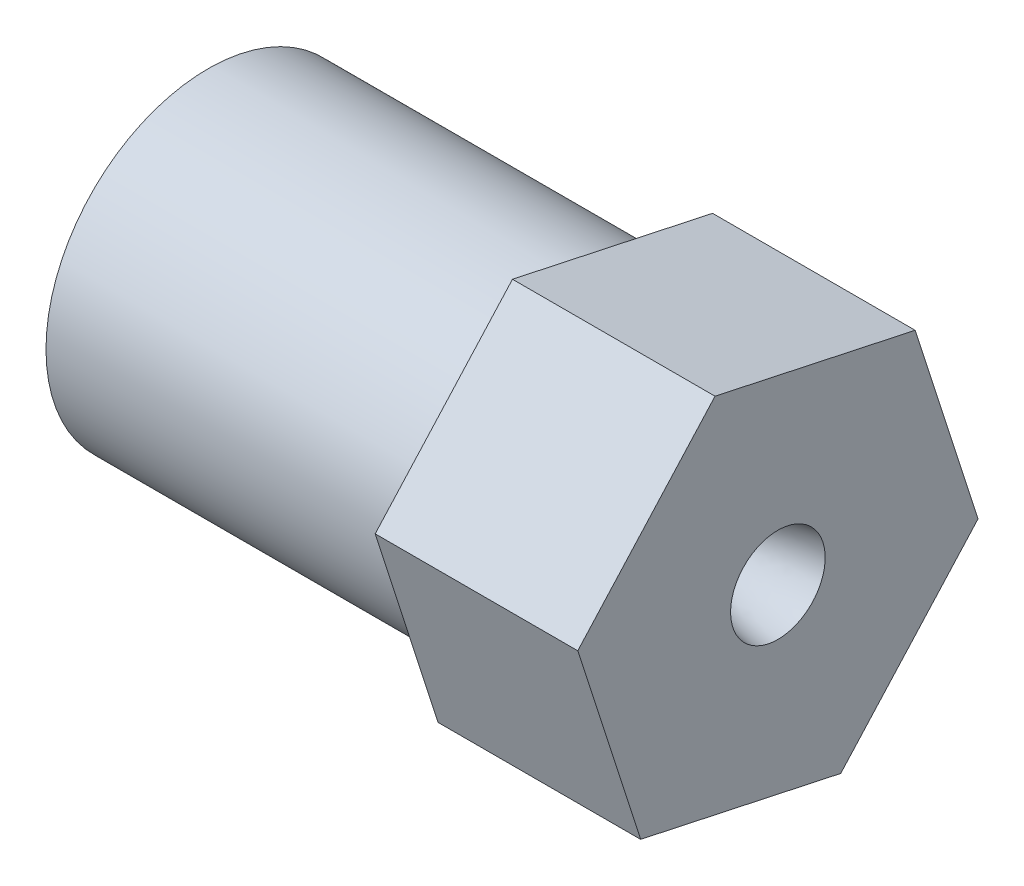
ISO-10303-21;
HEADER;
FILE_DESCRIPTION(('STEP AP214'),'2;1');
FILE_NAME('part.step','',(''),(''),'','','');
FILE_SCHEMA(('AUTOMOTIVE_DESIGN { 1 0 10303 214 1 1 1 1 }'));
ENDSEC;
DATA;
#1=APPLICATION_CONTEXT('core data for automotive mechanical design processes');
#2=APPLICATION_PROTOCOL_DEFINITION('international standard','automotive_design',2000,#1);
#3=PRODUCT_CONTEXT('',#1,'mechanical');
#4=PRODUCT('Part','Part','',(#3));
#5=PRODUCT_RELATED_PRODUCT_CATEGORY('part','',(#4));
#6=PRODUCT_DEFINITION_FORMATION('','',#4);
#7=PRODUCT_DEFINITION_CONTEXT('part definition',#1,'design');
#8=PRODUCT_DEFINITION('design','',#6,#7);
#9=PRODUCT_DEFINITION_SHAPE('','',#8);
#10=(LENGTH_UNIT() NAMED_UNIT(*) SI_UNIT(.MILLI.,.METRE.));
#11=(NAMED_UNIT(*) PLANE_ANGLE_UNIT() SI_UNIT($,.RADIAN.));
#12=(NAMED_UNIT(*) SI_UNIT($,.STERADIAN.) SOLID_ANGLE_UNIT());
#13=UNCERTAINTY_MEASURE_WITH_UNIT(LENGTH_MEASURE(1.E-05),#10,'distance_accuracy_value','');
#14=(GEOMETRIC_REPRESENTATION_CONTEXT(3) GLOBAL_UNCERTAINTY_ASSIGNED_CONTEXT((#13)) GLOBAL_UNIT_ASSIGNED_CONTEXT((#10,
#11,#12)) REPRESENTATION_CONTEXT('',''));
#15=CARTESIAN_POINT('',(0.,0.,0.));
#16=DIRECTION('',(0.,0.,1.));
#17=DIRECTION('',(1.,0.,0.));
#18=AXIS2_PLACEMENT_3D('',#15,#16,#17);
#19=CARTESIAN_POINT('',(0.,0.,0.));
#20=DIRECTION('',(-1.,0.,0.));
#21=DIRECTION('',(0.,0.,1.));
#22=AXIS2_PLACEMENT_3D('',#19,#20,#21);
#23=CYLINDRICAL_SURFACE('',#22,10.16);
#24=CARTESIAN_POINT('',(-9.36024884105208,0.,0.));
#25=DIRECTION('',(1.,0.,0.));
#26=DIRECTION('',(0.,0.,-1.));
#27=AXIS2_PLACEMENT_3D('',#24,#25,#26);
#28=CIRCLE('',#27,10.16);
#29=CARTESIAN_POINT('',(-9.36024884105208,0.,-10.16));
#30=VERTEX_POINT('',#29);
#31=EDGE_CURVE('E11',#30,#30,#28,.F.);
#32=ORIENTED_EDGE('',*,*,#31,.T.);
#33=EDGE_LOOP('',(#32));
#34=FACE_BOUND('',#33,.T.);
#35=CARTESIAN_POINT('',(-31.75,0.,0.));
#36=DIRECTION('',(-1.,0.,0.));
#37=DIRECTION('',(0.,0.,1.));
#38=AXIS2_PLACEMENT_3D('',#35,#36,#37);
#39=CIRCLE('',#38,10.16);
#40=CARTESIAN_POINT('',(-31.75,0.,10.16));
#41=VERTEX_POINT('',#40);
#42=EDGE_CURVE('E225',#41,#41,#39,.T.);
#43=ORIENTED_EDGE('',*,*,#42,.F.);
#44=EDGE_LOOP('',(#43));
#45=FACE_BOUND('',#44,.T.);
#46=ADVANCED_FACE('F37',(#34,#45),#23,.T.);
#47=CARTESIAN_POINT('',(0.,0.,0.));
#48=DIRECTION('',(-1.,0.,0.));
#49=DIRECTION('',(0.,0.,1.));
#50=AXIS2_PLACEMENT_3D('',#47,#48,#49);
#51=TOROIDAL_SURFACE('',#50,5.,3.);
#52=CARTESIAN_POINT('',(0.,0.,0.));
#53=DIRECTION('',(-1.,0.,0.));
#54=DIRECTION('',(0.,0.,1.));
#55=AXIS2_PLACEMENT_3D('',#52,#53,#54);
#56=CIRCLE('',#55,2.00000000003503);
#57=CARTESIAN_POINT('',(0.,0.,2.00000000003503));
#58=VERTEX_POINT('',#57);
#59=EDGE_CURVE('E177',#58,#58,#56,.T.);
#60=ORIENTED_EDGE('',*,*,#59,.F.);
#61=EDGE_LOOP('',(#60));
#62=FACE_BOUND('',#61,.T.);
#63=CARTESIAN_POINT('',(-2.12132034355962,0.,0.));
#64=DIRECTION('',(-1.,0.,0.));
#65=DIRECTION('',(0.,0.,1.));
#66=AXIS2_PLACEMENT_3D('',#63,#64,#65);
#67=CIRCLE('',#66,2.87867965644033);
#68=CARTESIAN_POINT('',(-2.12132034355962,0.,2.87867965644033));
#69=VERTEX_POINT('',#68);
#70=EDGE_CURVE('E142',#69,#69,#67,.T.);
#71=ORIENTED_EDGE('',*,*,#70,.T.);
#72=EDGE_LOOP('',(#71));
#73=FACE_BOUND('',#72,.T.);
#74=ADVANCED_FACE('F166',(#62,#73),#51,.T.);
#75=CARTESIAN_POINT('',(0.,0.,0.));
#76=DIRECTION('',(-1.,0.,0.));
#77=DIRECTION('',(0.,0.,1.));
#78=AXIS2_PLACEMENT_3D('',#75,#76,#77);
#79=TOROIDAL_SURFACE('',#78,2.8,0.799999999964973);
#80=CARTESIAN_POINT('',(0.27361611494392,0.,0.));
#81=DIRECTION('',(-1.,0.,0.));
#82=DIRECTION('',(0.,0.,1.));
#83=AXIS2_PLACEMENT_3D('',#80,#81,#82);
#84=CIRCLE('',#83,2.04824590372976);
#85=CARTESIAN_POINT('',(0.27361611494392,0.,2.04824590372976));
#86=VERTEX_POINT('',#85);
#87=EDGE_CURVE('E231',#86,#86,#84,.T.);
#88=ORIENTED_EDGE('',*,*,#87,.F.);
#89=EDGE_LOOP('',(#88));
#90=FACE_BOUND('',#89,.T.);
#91=ORIENTED_EDGE('',*,*,#59,.T.);
#92=EDGE_LOOP('',(#91));
#93=FACE_BOUND('',#92,.T.);
#94=ADVANCED_FACE('F162',(#90,#93),#79,.T.);
#95=CARTESIAN_POINT('',(336407.394437412,-941733.545655878,0.));
#96=CARTESIAN_POINT('',(-342019.869711802,939694.669030994,0.));
#97=CARTESIAN_POINT('',(347633.439450651,-937647.599422496,0.));
#98=B_SPLINE_CURVE_WITH_KNOTS('',2,(#95,#96,#97),.UNSPECIFIED.,.F.,.F.,(3,3),(0.,1.),.UNSPECIFIED.);
#99=CARTESIAN_POINT('',(0.,0.,0.));
#100=DIRECTION('',(-1.,0.,0.));
#101=AXIS1_PLACEMENT('',#99,#100);
#102=SURFACE_OF_REVOLUTION('',#98,#101);
#103=CARTESIAN_POINT('',(3.97475115894792,0.,0.));
#104=DIRECTION('',(-1.,0.,0.));
#105=DIRECTION('',(0.,0.,1.));
#106=AXIS2_PLACEMENT_3D('',#103,#104,#105);
#107=CIRCLE('',#106,2.96647939483827);
#108=CARTESIAN_POINT('',(3.97475115894792,0.,2.96647939483827));
#109=VERTEX_POINT('',#108);
#110=EDGE_CURVE('E228',#109,#109,#107,.T.);
#111=ORIENTED_EDGE('',*,*,#110,.F.);
#112=EDGE_LOOP('',(#111));
#113=FACE_BOUND('',#112,.T.);
#114=ORIENTED_EDGE('',*,*,#87,.T.);
#115=EDGE_LOOP('',(#114));
#116=FACE_BOUND('',#115,.T.);
#117=ADVANCED_FACE('F157',(#113,#116),#102,.T.);
#118=CARTESIAN_POINT('',(3.97475115894792,10.16,0.));
#119=DIRECTION('',(-1.,0.,0.));
#120=DIRECTION('',(0.,0.,1.));
#121=AXIS2_PLACEMENT_3D('',#118,#119,#120);
#122=PLANE('',#121);
#123=ORIENTED_EDGE('',*,*,#110,.T.);
#124=EDGE_LOOP('',(#123));
#125=FACE_BOUND('',#124,.T.);
#126=DIRECTION('',(0.,-0.951681663898051,-0.307086324345838));
#127=VECTOR('',#126,1.);
#128=CARTESIAN_POINT('',(3.97475115894792,-3.41249677929312,10.5755624900671));
#129=LINE('',#128,#127);
#130=CARTESIAN_POINT('',(3.97475115894792,2.69330707117882,12.5457684242007));
#131=VERTEX_POINT('',#130);
#132=CARTESIAN_POINT('',(3.97475115894792,-9.51830062976507,8.60535655593348));
#133=VERTEX_POINT('',#132);
#134=EDGE_CURVE('E125',#131,#133,#129,.T.);
#135=ORIENTED_EDGE('',*,*,#134,.T.);
#136=DIRECTION('',(0.,-0.209896273910742,-0.977723659424475));
#137=VECTOR('',#136,1.);
#138=CARTESIAN_POINT('',(3.97475115894792,-10.8649541653545,2.33247234383312));
#139=LINE('',#138,#137);
#140=CARTESIAN_POINT('',(3.97475115894792,-12.2116077009439,-3.94041186826723));
#141=VERTEX_POINT('',#140);
#142=EDGE_CURVE('E128',#133,#141,#139,.T.);
#143=ORIENTED_EDGE('',*,*,#142,.T.);
#144=DIRECTION('',(0.,0.741785389987309,-0.670637335078637));
#145=VECTOR('',#144,1.);
#146=CARTESIAN_POINT('',(3.97475115894792,-7.45245738606136,-8.24309014623397));
#147=LINE('',#146,#145);
#148=CARTESIAN_POINT('',(3.97475115894792,-2.69330707117882,-12.5457684242007));
#149=VERTEX_POINT('',#148);
#150=EDGE_CURVE('E131',#141,#149,#147,.T.);
#151=ORIENTED_EDGE('',*,*,#150,.T.);
#152=DIRECTION('',(0.,0.951681663898051,0.307086324345838));
#153=VECTOR('',#152,1.);
#154=CARTESIAN_POINT('',(3.97475115894792,3.41249677929312,-10.5755624900671));
#155=LINE('',#154,#153);
#156=CARTESIAN_POINT('',(3.97475115894792,9.51830062976506,-8.60535655593348));
#157=VERTEX_POINT('',#156);
#158=EDGE_CURVE('E134',#149,#157,#155,.T.);
#159=ORIENTED_EDGE('',*,*,#158,.T.);
#160=DIRECTION('',(0.,0.209896273910742,0.977723659424475));
#161=VECTOR('',#160,1.);
#162=CARTESIAN_POINT('',(3.97475115894792,10.8649541653545,-2.33247234383312));
#163=LINE('',#162,#161);
#164=CARTESIAN_POINT('',(3.97475115894792,12.2116077009439,3.94041186826724));
#165=VERTEX_POINT('',#164);
#166=EDGE_CURVE('E102',#157,#165,#163,.T.);
#167=ORIENTED_EDGE('',*,*,#166,.T.);
#168=DIRECTION('',(0.,-0.741785389987309,0.670637335078637));
#169=VECTOR('',#168,1.);
#170=CARTESIAN_POINT('',(3.97475115894792,7.45245738606136,8.24309014623397));
#171=LINE('',#170,#169);
#172=EDGE_CURVE('E137',#165,#131,#171,.T.);
#173=ORIENTED_EDGE('',*,*,#172,.T.);
#174=EDGE_LOOP('',(#135,#143,#151,#159,#167,#173));
#175=FACE_BOUND('',#174,.T.);
#176=ADVANCED_FACE('F161',(#125,#175),#122,.F.);
#177=CARTESIAN_POINT('',(-31.75,10.16,0.));
#178=DIRECTION('',(1.,0.,0.));
#179=DIRECTION('',(0.,0.,-1.));
#180=AXIS2_PLACEMENT_3D('',#177,#178,#179);
#181=PLANE('',#180);
#182=CARTESIAN_POINT('',(-31.75,0.,0.));
#183=DIRECTION('',(-1.,0.,0.));
#184=DIRECTION('',(0.,0.,1.));
#185=AXIS2_PLACEMENT_3D('',#182,#183,#184);
#186=CIRCLE('',#185,8.6614);
#187=CARTESIAN_POINT('',(-31.75,0.,8.6614));
#188=VERTEX_POINT('',#187);
#189=EDGE_CURVE('E222',#188,#188,#186,.T.);
#190=ORIENTED_EDGE('',*,*,#189,.F.);
#191=EDGE_LOOP('',(#190));
#192=FACE_BOUND('',#191,.T.);
#193=ORIENTED_EDGE('',*,*,#42,.T.);
#194=EDGE_LOOP('',(#193));
#195=FACE_BOUND('',#194,.T.);
#196=ADVANCED_FACE('F249',(#192,#195),#181,.F.);
#197=CARTESIAN_POINT('',(-31.115,0.,0.));
#198=DIRECTION('',(-1.,0.,0.));
#199=DIRECTION('',(0.,0.,1.));
#200=AXIS2_PLACEMENT_3D('',#197,#198,#199);
#201=TOROIDAL_SURFACE('',#200,8.6614,0.635);
#202=CARTESIAN_POINT('',(-31.115,0.,0.));
#203=DIRECTION('',(-1.,0.,0.));
#204=DIRECTION('',(0.,0.,1.));
#205=AXIS2_PLACEMENT_3D('',#202,#203,#204);
#206=CIRCLE('',#205,8.02639999999999);
#207=CARTESIAN_POINT('',(-31.115,0.,8.02639999999999));
#208=VERTEX_POINT('',#207);
#209=EDGE_CURVE('E219',#208,#208,#206,.T.);
#210=ORIENTED_EDGE('',*,*,#209,.F.);
#211=EDGE_LOOP('',(#210));
#212=FACE_BOUND('',#211,.T.);
#213=ORIENTED_EDGE('',*,*,#189,.T.);
#214=EDGE_LOOP('',(#213));
#215=FACE_BOUND('',#214,.T.);
#216=ADVANCED_FACE('F251',(#212,#215),#201,.T.);
#217=CARTESIAN_POINT('',(0.,0.,0.));
#218=DIRECTION('',(-1.,0.,0.));
#219=DIRECTION('',(0.,0.,1.));
#220=AXIS2_PLACEMENT_3D('',#217,#218,#219);
#221=CYLINDRICAL_SURFACE('',#220,8.02639999999999);
#222=CARTESIAN_POINT('',(-25.019,0.,0.));
#223=DIRECTION('',(-1.,0.,0.));
#224=DIRECTION('',(0.,0.,1.));
#225=AXIS2_PLACEMENT_3D('',#222,#223,#224);
#226=CIRCLE('',#225,8.02639999999999);
#227=CARTESIAN_POINT('',(-25.019,0.,8.02639999999999));
#228=VERTEX_POINT('',#227);
#229=EDGE_CURVE('E216',#228,#228,#226,.T.);
#230=ORIENTED_EDGE('',*,*,#229,.F.);
#231=EDGE_LOOP('',(#230));
#232=FACE_BOUND('',#231,.T.);
#233=ORIENTED_EDGE('',*,*,#209,.T.);
#234=EDGE_LOOP('',(#233));
#235=FACE_BOUND('',#234,.T.);
#236=ADVANCED_FACE('F258',(#232,#235),#221,.F.);
#237=CARTESIAN_POINT('',(-25.019,0.,0.));
#238=DIRECTION('',(-1.,0.,0.));
#239=DIRECTION('',(0.,0.,1.));
#240=AXIS2_PLACEMENT_3D('',#237,#238,#239);
#241=TOROIDAL_SURFACE('',#240,7.89939999999999,0.127);
#242=CARTESIAN_POINT('',(-24.892,0.,0.));
#243=DIRECTION('',(-1.,0.,0.));
#244=DIRECTION('',(0.,0.,1.));
#245=AXIS2_PLACEMENT_3D('',#242,#243,#244);
#246=CIRCLE('',#245,7.89939999999999);
#247=CARTESIAN_POINT('',(-24.892,0.,7.89939999999999));
#248=VERTEX_POINT('',#247);
#249=EDGE_CURVE('E213',#248,#248,#246,.T.);
#250=ORIENTED_EDGE('',*,*,#249,.F.);
#251=EDGE_LOOP('',(#250));
#252=FACE_BOUND('',#251,.T.);
#253=ORIENTED_EDGE('',*,*,#229,.T.);
#254=EDGE_LOOP('',(#253));
#255=FACE_BOUND('',#254,.T.);
#256=ADVANCED_FACE('F266',(#252,#255),#241,.F.);
#257=CARTESIAN_POINT('',(-24.892,6.9469,0.));
#258=DIRECTION('',(1.,0.,0.));
#259=DIRECTION('',(0.,0.,-1.));
#260=AXIS2_PLACEMENT_3D('',#257,#258,#259);
#261=PLANE('',#260);
#262=CARTESIAN_POINT('',(-24.892,0.,0.));
#263=DIRECTION('',(-1.,0.,0.));
#264=DIRECTION('',(0.,0.,1.));
#265=AXIS2_PLACEMENT_3D('',#262,#263,#264);
#266=CIRCLE('',#265,6.9469);
#267=CARTESIAN_POINT('',(-24.892,0.,6.9469));
#268=VERTEX_POINT('',#267);
#269=EDGE_CURVE('E210',#268,#268,#266,.T.);
#270=ORIENTED_EDGE('',*,*,#269,.F.);
#271=EDGE_LOOP('',(#270));
#272=FACE_BOUND('',#271,.T.);
#273=ORIENTED_EDGE('',*,*,#249,.T.);
#274=EDGE_LOOP('',(#273));
#275=FACE_BOUND('',#274,.T.);
#276=ADVANCED_FACE('F270',(#272,#275),#261,.F.);
#277=CARTESIAN_POINT('',(0.,0.,0.));
#278=DIRECTION('',(-1.,0.,0.));
#279=DIRECTION('',(0.,0.,1.));
#280=AXIS2_PLACEMENT_3D('',#277,#278,#279);
#281=CYLINDRICAL_SURFACE('',#280,6.9469);
#282=CARTESIAN_POINT('',(-20.066,0.,0.));
#283=DIRECTION('',(-1.,0.,0.));
#284=DIRECTION('',(0.,0.,1.));
#285=AXIS2_PLACEMENT_3D('',#282,#283,#284);
#286=CIRCLE('',#285,6.9469);
#287=CARTESIAN_POINT('',(-20.066,0.,6.9469));
#288=VERTEX_POINT('',#287);
#289=EDGE_CURVE('E207',#288,#288,#286,.T.);
#290=ORIENTED_EDGE('',*,*,#289,.F.);
#291=EDGE_LOOP('',(#290));
#292=FACE_BOUND('',#291,.T.);
#293=ORIENTED_EDGE('',*,*,#269,.T.);
#294=EDGE_LOOP('',(#293));
#295=FACE_BOUND('',#294,.T.);
#296=ADVANCED_FACE('F274',(#292,#295),#281,.F.);
#297=CARTESIAN_POINT('',(-20.066,0.,0.));
#298=DIRECTION('',(-1.,0.,0.));
#299=DIRECTION('',(0.,0.,1.));
#300=AXIS2_PLACEMENT_3D('',#297,#298,#299);
#301=TOROIDAL_SURFACE('',#300,6.8199,0.127);
#302=CARTESIAN_POINT('',(-19.939,0.,0.));
#303=DIRECTION('',(-1.,0.,0.));
#304=DIRECTION('',(0.,0.,1.));
#305=AXIS2_PLACEMENT_3D('',#302,#303,#304);
#306=CIRCLE('',#305,6.8199);
#307=CARTESIAN_POINT('',(-19.939,0.,6.8199));
#308=VERTEX_POINT('',#307);
#309=EDGE_CURVE('E204',#308,#308,#306,.T.);
#310=ORIENTED_EDGE('',*,*,#309,.F.);
#311=EDGE_LOOP('',(#310));
#312=FACE_BOUND('',#311,.T.);
#313=ORIENTED_EDGE('',*,*,#289,.T.);
#314=EDGE_LOOP('',(#313));
#315=FACE_BOUND('',#314,.T.);
#316=ADVANCED_FACE('F278',(#312,#315),#301,.F.);
#317=CARTESIAN_POINT('',(-19.939,5.46100000000001,0.));
#318=DIRECTION('',(1.,0.,0.));
#319=DIRECTION('',(0.,0.,-1.));
#320=AXIS2_PLACEMENT_3D('',#317,#318,#319);
#321=PLANE('',#320);
#322=CARTESIAN_POINT('',(-19.939,0.,0.));
#323=DIRECTION('',(-1.,0.,0.));
#324=DIRECTION('',(0.,0.,1.));
#325=AXIS2_PLACEMENT_3D('',#322,#323,#324);
#326=CIRCLE('',#325,5.46100000000001);
#327=CARTESIAN_POINT('',(-19.939,0.,5.46100000000001));
#328=VERTEX_POINT('',#327);
#329=EDGE_CURVE('E201',#328,#328,#326,.T.);
#330=ORIENTED_EDGE('',*,*,#329,.F.);
#331=EDGE_LOOP('',(#330));
#332=FACE_BOUND('',#331,.T.);
#333=ORIENTED_EDGE('',*,*,#309,.T.);
#334=EDGE_LOOP('',(#333));
#335=FACE_BOUND('',#334,.T.);
#336=ADVANCED_FACE('F282',(#332,#335),#321,.F.);
#337=CARTESIAN_POINT('',(-19.304,0.,0.));
#338=DIRECTION('',(-1.,0.,0.));
#339=DIRECTION('',(0.,0.,1.));
#340=AXIS2_PLACEMENT_3D('',#337,#338,#339);
#341=TOROIDAL_SURFACE('',#340,5.461,0.635);
#342=CARTESIAN_POINT('',(-19.304,0.,0.));
#343=DIRECTION('',(-1.,0.,0.));
#344=DIRECTION('',(0.,0.,1.));
#345=AXIS2_PLACEMENT_3D('',#342,#343,#344);
#346=CIRCLE('',#345,4.826);
#347=CARTESIAN_POINT('',(-19.304,0.,4.826));
#348=VERTEX_POINT('',#347);
#349=EDGE_CURVE('E198',#348,#348,#346,.T.);
#350=ORIENTED_EDGE('',*,*,#349,.F.);
#351=EDGE_LOOP('',(#350));
#352=FACE_BOUND('',#351,.T.);
#353=ORIENTED_EDGE('',*,*,#329,.T.);
#354=EDGE_LOOP('',(#353));
#355=FACE_BOUND('',#354,.T.);
#356=ADVANCED_FACE('F286',(#352,#355),#341,.T.);
#357=CARTESIAN_POINT('',(0.,0.,0.));
#358=DIRECTION('',(-1.,0.,0.));
#359=DIRECTION('',(0.,0.,1.));
#360=AXIS2_PLACEMENT_3D('',#357,#358,#359);
#361=CYLINDRICAL_SURFACE('',#360,4.826);
#362=CARTESIAN_POINT('',(-13.589,0.,0.));
#363=DIRECTION('',(-1.,0.,0.));
#364=DIRECTION('',(0.,0.,1.));
#365=AXIS2_PLACEMENT_3D('',#362,#363,#364);
#366=CIRCLE('',#365,4.826);
#367=CARTESIAN_POINT('',(-13.589,0.,4.826));
#368=VERTEX_POINT('',#367);
#369=EDGE_CURVE('E195',#368,#368,#366,.T.);
#370=ORIENTED_EDGE('',*,*,#369,.F.);
#371=EDGE_LOOP('',(#370));
#372=FACE_BOUND('',#371,.T.);
#373=ORIENTED_EDGE('',*,*,#349,.T.);
#374=EDGE_LOOP('',(#373));
#375=FACE_BOUND('',#374,.T.);
#376=ADVANCED_FACE('F290',(#372,#375),#361,.F.);
#377=CARTESIAN_POINT('',(-13.589,0.,0.));
#378=DIRECTION('',(-1.,0.,0.));
#379=DIRECTION('',(0.,0.,1.));
#380=AXIS2_PLACEMENT_3D('',#377,#378,#379);
#381=TOROIDAL_SURFACE('',#380,4.699,0.127);
#382=CARTESIAN_POINT('',(-13.462,0.,0.));
#383=DIRECTION('',(-1.,0.,0.));
#384=DIRECTION('',(0.,0.,1.));
#385=AXIS2_PLACEMENT_3D('',#382,#383,#384);
#386=CIRCLE('',#385,4.699);
#387=CARTESIAN_POINT('',(-13.462,0.,4.699));
#388=VERTEX_POINT('',#387);
#389=EDGE_CURVE('E192',#388,#388,#386,.T.);
#390=ORIENTED_EDGE('',*,*,#389,.F.);
#391=EDGE_LOOP('',(#390));
#392=FACE_BOUND('',#391,.T.);
#393=ORIENTED_EDGE('',*,*,#369,.T.);
#394=EDGE_LOOP('',(#393));
#395=FACE_BOUND('',#394,.T.);
#396=ADVANCED_FACE('F294',(#392,#395),#381,.F.);
#397=CARTESIAN_POINT('',(-13.462,4.445,0.));
#398=DIRECTION('',(1.,0.,0.));
#399=DIRECTION('',(0.,0.,-1.));
#400=AXIS2_PLACEMENT_3D('',#397,#398,#399);
#401=PLANE('',#400);
#402=CARTESIAN_POINT('',(-13.462,0.,0.));
#403=DIRECTION('',(-1.,0.,0.));
#404=DIRECTION('',(0.,0.,1.));
#405=AXIS2_PLACEMENT_3D('',#402,#403,#404);
#406=CIRCLE('',#405,4.445);
#407=CARTESIAN_POINT('',(-13.462,0.,4.445));
#408=VERTEX_POINT('',#407);
#409=EDGE_CURVE('E187',#408,#408,#406,.T.);
#410=ORIENTED_EDGE('',*,*,#409,.F.);
#411=EDGE_LOOP('',(#410));
#412=FACE_BOUND('',#411,.T.);
#413=ORIENTED_EDGE('',*,*,#389,.T.);
#414=EDGE_LOOP('',(#413));
#415=FACE_BOUND('',#414,.T.);
#416=ADVANCED_FACE('F298',(#412,#415),#401,.F.);
#417=CARTESIAN_POINT('',(0.,0.,0.));
#418=DIRECTION('',(-1.,0.,0.));
#419=DIRECTION('',(0.,0.,1.));
#420=AXIS2_PLACEMENT_3D('',#417,#418,#419);
#421=CYLINDRICAL_SURFACE('',#420,4.445);
#422=CARTESIAN_POINT('',(-5.00276874765388,0.,0.));
#423=DIRECTION('',(-1.,0.,0.));
#424=DIRECTION('',(0.,0.,1.));
#425=AXIS2_PLACEMENT_3D('',#422,#423,#424);
#426=CIRCLE('',#425,4.445);
#427=CARTESIAN_POINT('',(-5.00276874765388,0.,4.445));
#428=VERTEX_POINT('',#427);
#429=EDGE_CURVE('E183',#428,#428,#426,.T.);
#430=ORIENTED_EDGE('',*,*,#429,.F.);
#431=EDGE_LOOP('',(#430));
#432=FACE_BOUND('',#431,.T.);
#433=ORIENTED_EDGE('',*,*,#409,.T.);
#434=EDGE_LOOP('',(#433));
#435=FACE_BOUND('',#434,.T.);
#436=ADVANCED_FACE('F302',(#432,#435),#421,.F.);
#437=CARTESIAN_POINT('',(-5.00276874765388,0.,0.));
#438=DIRECTION('',(-1.,0.,0.));
#439=DIRECTION('',(0.,0.,1.));
#440=AXIS2_PLACEMENT_3D('',#437,#438,#439);
#441=DEGENERATE_TOROIDAL_SURFACE('',#440,1.27,3.175,.T.);
#442=CARTESIAN_POINT('',(-2.75770471738661,0.,0.));
#443=DIRECTION('',(-1.,0.,0.));
#444=DIRECTION('',(0.,0.,1.));
#445=AXIS2_PLACEMENT_3D('',#442,#443,#444);
#446=CIRCLE('',#445,3.51506403026731);
#447=CARTESIAN_POINT('',(-2.75770471738661,0.,3.51506403026731));
#448=VERTEX_POINT('',#447);
#449=EDGE_CURVE('E181',#448,#448,#446,.T.);
#450=ORIENTED_EDGE('',*,*,#449,.F.);
#451=EDGE_LOOP('',(#450));
#452=FACE_BOUND('',#451,.T.);
#453=ORIENTED_EDGE('',*,*,#429,.T.);
#454=EDGE_LOOP('',(#453));
#455=FACE_BOUND('',#454,.T.);
#456=ADVANCED_FACE('F306',(#452,#455),#441,.F.);
#457=CARTESIAN_POINT('',(-2.75770471738661,0.,0.));
#458=DIRECTION('',(-1.,0.,0.));
#459=DIRECTION('',(0.,0.,1.));
#460=AXIS2_PLACEMENT_3D('',#457,#458,#459);
#461=CONICAL_SURFACE('',#460,3.51506403026731,0.785398163397437);
#462=ORIENTED_EDGE('',*,*,#70,.F.);
#463=EDGE_LOOP('',(#462));
#464=FACE_BOUND('',#463,.T.);
#465=ORIENTED_EDGE('',*,*,#449,.T.);
#466=EDGE_LOOP('',(#465));
#467=FACE_BOUND('',#466,.T.);
#468=ADVANCED_FACE('F310',(#464,#467),#461,.F.);
#469=CARTESIAN_POINT('',(-8.72524884105208,-3.41249677929312,10.5755624900671));
#470=DIRECTION('',(0.,-0.307086324345838,0.951681663898051));
#471=DIRECTION('',(0.,-0.951681663898051,-0.307086324345838));
#472=AXIS2_PLACEMENT_3D('',#469,#470,#471);
#473=PLANE('',#472);
#474=ORIENTED_EDGE('',*,*,#134,.F.);
#475=DIRECTION('',(1.,0.,0.));
#476=VECTOR('',#475,1.);
#477=CARTESIAN_POINT('',(-8.72524884105208,2.69330707117882,12.5457684242007));
#478=LINE('',#477,#476);
#479=CARTESIAN_POINT('',(-8.72524884105208,2.69330707117882,12.5457684242007));
#480=VERTEX_POINT('',#479);
#481=EDGE_CURVE('E54',#480,#131,#478,.T.);
#482=ORIENTED_EDGE('',*,*,#481,.F.);
#483=DIRECTION('',(0.,-0.951681663898051,-0.307086324345838));
#484=VECTOR('',#483,1.);
#485=CARTESIAN_POINT('',(-8.72524884105208,-3.41249677929312,10.5755624900671));
#486=LINE('',#485,#484);
#487=CARTESIAN_POINT('',(-8.72524884105208,-9.51830062976507,8.60535655593348));
#488=VERTEX_POINT('',#487);
#489=EDGE_CURVE('E140',#480,#488,#486,.T.);
#490=ORIENTED_EDGE('',*,*,#489,.T.);
#491=DIRECTION('',(1.,0.,0.));
#492=VECTOR('',#491,1.);
#493=CARTESIAN_POINT('',(-8.72524884105208,-9.51830062976507,8.60535655593348));
#494=LINE('',#493,#492);
#495=EDGE_CURVE('E89',#488,#133,#494,.T.);
#496=ORIENTED_EDGE('',*,*,#495,.T.);
#497=EDGE_LOOP('',(#474,#482,#490,#496));
#498=FACE_BOUND('',#497,.T.);
#499=ADVANCED_FACE('F314',(#498),#473,.T.);
#500=CARTESIAN_POINT('',(-8.72524884105208,7.45245738606136,8.24309014623397));
#501=DIRECTION('',(0.,0.670637335078637,0.741785389987309));
#502=DIRECTION('',(0.,-0.741785389987309,0.670637335078637));
#503=AXIS2_PLACEMENT_3D('',#500,#501,#502);
#504=PLANE('',#503);
#505=ORIENTED_EDGE('',*,*,#172,.F.);
#506=DIRECTION('',(1.,0.,0.));
#507=VECTOR('',#506,1.);
#508=CARTESIAN_POINT('',(-8.72524884105208,12.2116077009439,3.94041186826724));
#509=LINE('',#508,#507);
#510=CARTESIAN_POINT('',(-8.72524884105208,12.2116077009439,3.94041186826724));
#511=VERTEX_POINT('',#510);
#512=EDGE_CURVE('E77',#511,#165,#509,.T.);
#513=ORIENTED_EDGE('',*,*,#512,.F.);
#514=DIRECTION('',(0.,-0.741785389987309,0.670637335078637));
#515=VECTOR('',#514,1.);
#516=CARTESIAN_POINT('',(-8.72524884105208,7.45245738606136,8.24309014623397));
#517=LINE('',#516,#515);
#518=EDGE_CURVE('E115',#511,#480,#517,.T.);
#519=ORIENTED_EDGE('',*,*,#518,.T.);
#520=ORIENTED_EDGE('',*,*,#481,.T.);
#521=EDGE_LOOP('',(#505,#513,#519,#520));
#522=FACE_BOUND('',#521,.T.);
#523=ADVANCED_FACE('F317',(#522),#504,.T.);
#524=CARTESIAN_POINT('',(-8.72524884105208,10.8649541653545,-2.33247234383312));
#525=DIRECTION('',(0.,0.977723659424475,-0.209896273910742));
#526=DIRECTION('',(0.,0.209896273910742,0.977723659424475));
#527=AXIS2_PLACEMENT_3D('',#524,#525,#526);
#528=PLANE('',#527);
#529=ORIENTED_EDGE('',*,*,#166,.F.);
#530=DIRECTION('',(1.,0.,0.));
#531=VECTOR('',#530,1.);
#532=CARTESIAN_POINT('',(-8.72524884105208,9.51830062976506,-8.60535655593348));
#533=LINE('',#532,#531);
#534=CARTESIAN_POINT('',(-8.72524884105208,9.51830062976506,-8.60535655593348));
#535=VERTEX_POINT('',#534);
#536=EDGE_CURVE('E97',#535,#157,#533,.T.);
#537=ORIENTED_EDGE('',*,*,#536,.F.);
#538=DIRECTION('',(0.,0.209896273910742,0.977723659424475));
#539=VECTOR('',#538,1.);
#540=CARTESIAN_POINT('',(-8.72524884105208,10.8649541653545,-2.33247234383312));
#541=LINE('',#540,#539);
#542=EDGE_CURVE('E100',#535,#511,#541,.T.);
#543=ORIENTED_EDGE('',*,*,#542,.T.);
#544=ORIENTED_EDGE('',*,*,#512,.T.);
#545=EDGE_LOOP('',(#529,#537,#543,#544));
#546=FACE_BOUND('',#545,.T.);
#547=ADVANCED_FACE('F99',(#546),#528,.T.);
#548=CARTESIAN_POINT('',(-8.72524884105208,3.41249677929312,-10.5755624900671));
#549=DIRECTION('',(0.,0.307086324345838,-0.951681663898051));
#550=DIRECTION('',(0.,0.951681663898051,0.307086324345838));
#551=AXIS2_PLACEMENT_3D('',#548,#549,#550);
#552=PLANE('',#551);
#553=ORIENTED_EDGE('',*,*,#158,.F.);
#554=DIRECTION('',(1.,0.,0.));
#555=VECTOR('',#554,1.);
#556=CARTESIAN_POINT('',(-8.72524884105208,-2.69330707117882,-12.5457684242007));
#557=LINE('',#556,#555);
#558=CARTESIAN_POINT('',(-8.72524884105208,-2.69330707117882,-12.5457684242007));
#559=VERTEX_POINT('',#558);
#560=EDGE_CURVE('E107',#559,#149,#557,.T.);
#561=ORIENTED_EDGE('',*,*,#560,.F.);
#562=DIRECTION('',(0.,0.951681663898051,0.307086324345838));
#563=VECTOR('',#562,1.);
#564=CARTESIAN_POINT('',(-8.72524884105208,3.41249677929312,-10.5755624900671));
#565=LINE('',#564,#563);
#566=EDGE_CURVE('E113',#559,#535,#565,.T.);
#567=ORIENTED_EDGE('',*,*,#566,.T.);
#568=ORIENTED_EDGE('',*,*,#536,.T.);
#569=EDGE_LOOP('',(#553,#561,#567,#568));
#570=FACE_BOUND('',#569,.T.);
#571=ADVANCED_FACE('F117',(#570),#552,.T.);
#572=CARTESIAN_POINT('',(-8.72524884105208,-7.45245738606136,-8.24309014623397));
#573=DIRECTION('',(0.,-0.670637335078637,-0.741785389987309));
#574=DIRECTION('',(0.,0.741785389987309,-0.670637335078637));
#575=AXIS2_PLACEMENT_3D('',#572,#573,#574);
#576=PLANE('',#575);
#577=ORIENTED_EDGE('',*,*,#150,.F.);
#578=DIRECTION('',(1.,0.,0.));
#579=VECTOR('',#578,1.);
#580=CARTESIAN_POINT('',(-8.72524884105208,-12.2116077009439,-3.94041186826723));
#581=LINE('',#580,#579);
#582=CARTESIAN_POINT('',(-8.72524884105208,-12.2116077009439,-3.94041186826723));
#583=VERTEX_POINT('',#582);
#584=EDGE_CURVE('E145',#583,#141,#581,.T.);
#585=ORIENTED_EDGE('',*,*,#584,.F.);
#586=DIRECTION('',(0.,0.741785389987309,-0.670637335078637));
#587=VECTOR('',#586,1.);
#588=CARTESIAN_POINT('',(-8.72524884105208,-7.45245738606136,-8.24309014623397));
#589=LINE('',#588,#587);
#590=EDGE_CURVE('E118',#583,#559,#589,.T.);
#591=ORIENTED_EDGE('',*,*,#590,.T.);
#592=ORIENTED_EDGE('',*,*,#560,.T.);
#593=EDGE_LOOP('',(#577,#585,#591,#592));
#594=FACE_BOUND('',#593,.T.);
#595=ADVANCED_FACE('F320',(#594),#576,.T.);
#596=CARTESIAN_POINT('',(-8.72524884105208,-10.8649541653545,2.33247234383312));
#597=DIRECTION('',(0.,-0.977723659424475,0.209896273910742));
#598=DIRECTION('',(0.,-0.209896273910742,-0.977723659424475));
#599=AXIS2_PLACEMENT_3D('',#596,#597,#598);
#600=PLANE('',#599);
#601=ORIENTED_EDGE('',*,*,#142,.F.);
#602=ORIENTED_EDGE('',*,*,#495,.F.);
#603=DIRECTION('',(0.,-0.209896273910742,-0.977723659424475));
#604=VECTOR('',#603,1.);
#605=CARTESIAN_POINT('',(-8.72524884105208,-10.8649541653545,2.33247234383312));
#606=LINE('',#605,#604);
#607=EDGE_CURVE('E120',#488,#583,#606,.T.);
#608=ORIENTED_EDGE('',*,*,#607,.T.);
#609=ORIENTED_EDGE('',*,*,#584,.T.);
#610=EDGE_LOOP('',(#601,#602,#608,#609));
#611=FACE_BOUND('',#610,.T.);
#612=ADVANCED_FACE('F243',(#611),#600,.T.);
#613=CARTESIAN_POINT('',(-8.72524884105208,0.,0.));
#614=DIRECTION('',(1.,0.,0.));
#615=DIRECTION('',(0.,0.,-1.));
#616=AXIS2_PLACEMENT_3D('',#613,#614,#615);
#617=PLANE('',#616);
#618=CARTESIAN_POINT('',(-8.72524884105208,0.,0.));
#619=DIRECTION('',(1.,0.,0.));
#620=DIRECTION('',(0.,0.,-1.));
#621=AXIS2_PLACEMENT_3D('',#618,#619,#620);
#622=CIRCLE('',#621,10.795);
#623=CARTESIAN_POINT('',(-8.72524884105208,0.,-10.795));
#624=VERTEX_POINT('',#623);
#625=EDGE_CURVE('E46',#624,#624,#622,.T.);
#626=ORIENTED_EDGE('',*,*,#625,.T.);
#627=EDGE_LOOP('',(#626));
#628=FACE_BOUND('',#627,.T.);
#629=ORIENTED_EDGE('',*,*,#489,.F.);
#630=ORIENTED_EDGE('',*,*,#518,.F.);
#631=ORIENTED_EDGE('',*,*,#542,.F.);
#632=ORIENTED_EDGE('',*,*,#566,.F.);
#633=ORIENTED_EDGE('',*,*,#590,.F.);
#634=ORIENTED_EDGE('',*,*,#607,.F.);
#635=EDGE_LOOP('',(#629,#630,#631,#632,#633,#634));
#636=FACE_BOUND('',#635,.T.);
#637=ADVANCED_FACE('F111',(#628,#636),#617,.F.);
#638=CARTESIAN_POINT('',(-9.36024884105208,0.,0.));
#639=DIRECTION('',(1.,0.,0.));
#640=DIRECTION('',(0.,0.,-1.));
#641=AXIS2_PLACEMENT_3D('',#638,#639,#640);
#642=TOROIDAL_SURFACE('',#641,10.795,0.635);
#643=ORIENTED_EDGE('',*,*,#31,.F.);
#644=EDGE_LOOP('',(#643));
#645=FACE_BOUND('',#644,.T.);
#646=ORIENTED_EDGE('',*,*,#625,.F.);
#647=EDGE_LOOP('',(#646));
#648=FACE_BOUND('',#647,.T.);
#649=ADVANCED_FACE('F39',(#645,#648),#642,.F.);
#650=CLOSED_SHELL('',(#46,#74,#94,#117,#176,#196,#216,#236,#256,#276,#296,#316,#336,#356,#376,
#396,#416,#436,#456,#468,#499,#523,#547,#571,#595,#612,#637,#649));
#651=MANIFOLD_SOLID_BREP('B2',#650);
#652=ADVANCED_BREP_SHAPE_REPRESENTATION('',(#18,#651),#14);
#653=SHAPE_DEFINITION_REPRESENTATION(#9,#652);
ENDSEC;
END-ISO-10303-21;
